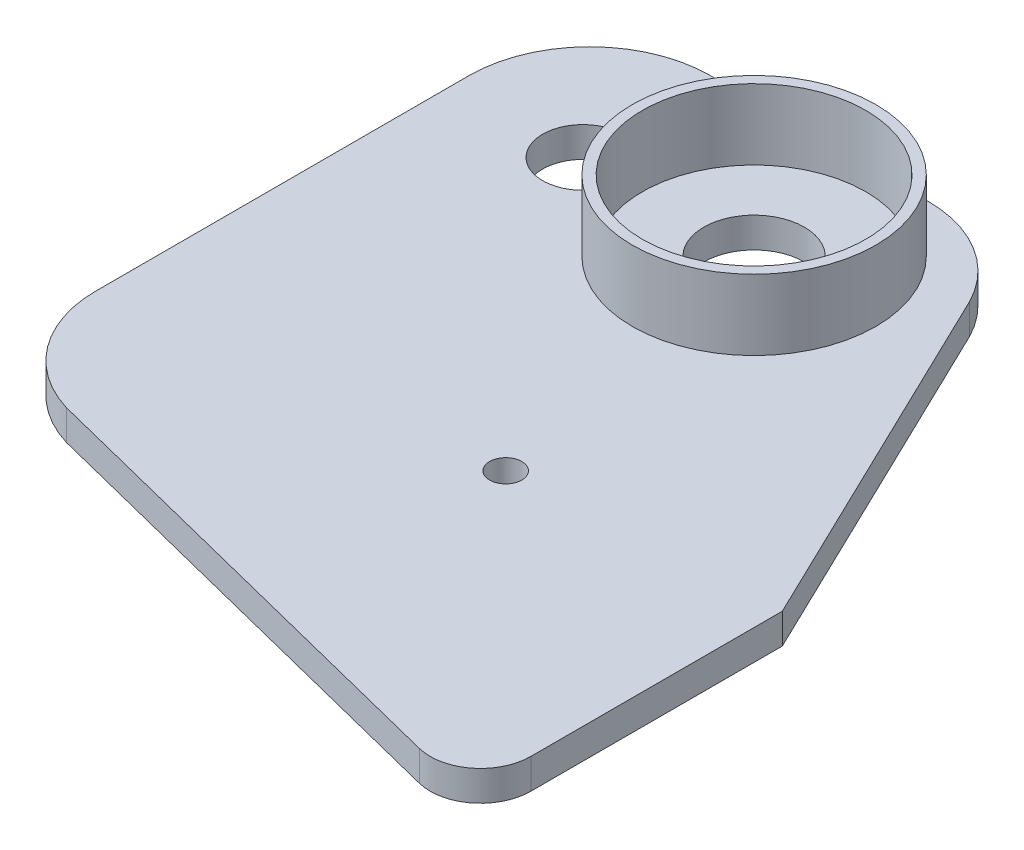
ISO-10303-21;
HEADER;
FILE_DESCRIPTION(('STEP AP214'),'2;1');
FILE_NAME('part.step','',(''),(''),'','','');
FILE_SCHEMA(('AUTOMOTIVE_DESIGN { 1 0 10303 214 1 1 1 1 }'));
ENDSEC;
DATA;
#1=APPLICATION_CONTEXT('core data for automotive mechanical design processes');
#2=APPLICATION_PROTOCOL_DEFINITION('international standard','automotive_design',2000,#1);
#3=PRODUCT_CONTEXT('',#1,'mechanical');
#4=PRODUCT('Part','Part','',(#3));
#5=PRODUCT_RELATED_PRODUCT_CATEGORY('part','',(#4));
#6=PRODUCT_DEFINITION_FORMATION('','',#4);
#7=PRODUCT_DEFINITION_CONTEXT('part definition',#1,'design');
#8=PRODUCT_DEFINITION('design','',#6,#7);
#9=PRODUCT_DEFINITION_SHAPE('','',#8);
#10=(LENGTH_UNIT() NAMED_UNIT(*) SI_UNIT(.MILLI.,.METRE.));
#11=(NAMED_UNIT(*) PLANE_ANGLE_UNIT() SI_UNIT($,.RADIAN.));
#12=(NAMED_UNIT(*) SI_UNIT($,.STERADIAN.) SOLID_ANGLE_UNIT());
#13=UNCERTAINTY_MEASURE_WITH_UNIT(LENGTH_MEASURE(1.E-05),#10,'distance_accuracy_value','');
#14=(GEOMETRIC_REPRESENTATION_CONTEXT(3) GLOBAL_UNCERTAINTY_ASSIGNED_CONTEXT((#13)) GLOBAL_UNIT_ASSIGNED_CONTEXT((#10,
#11,#12)) REPRESENTATION_CONTEXT('',''));
#15=CARTESIAN_POINT('',(0.,0.,0.));
#16=DIRECTION('',(0.,0.,1.));
#17=DIRECTION('',(1.,0.,0.));
#18=AXIS2_PLACEMENT_3D('',#15,#16,#17);
#19=CARTESIAN_POINT('',(40.0428743382507,3.,-32.216581250598));
#20=DIRECTION('',(0.,-1.,0.));
#21=DIRECTION('',(0.,0.,-1.));
#22=AXIS2_PLACEMENT_3D('',#19,#20,#21);
#23=PLANE('',#22);
#24=CARTESIAN_POINT('',(36.135474474537,3.,-30.8460471676936));
#25=DIRECTION('',(0.,1.,0.));
#26=DIRECTION('',(0.,0.,-1.));
#27=AXIS2_PLACEMENT_3D('',#24,#25,#26);
#28=CIRCLE('',#27,5.00000000000001);
#29=CARTESIAN_POINT('',(36.135474474537,3.,-35.8460471676936));
#30=VERTEX_POINT('',#29);
#31=EDGE_CURVE('E446',#30,#30,#28,.T.);
#32=ORIENTED_EDGE('',*,*,#31,.F.);
#33=EDGE_LOOP('',(#32));
#34=FACE_BOUND('',#33,.T.);
#35=CARTESIAN_POINT('',(36.135474474537,3.,-30.8460471676936));
#36=DIRECTION('',(0.,1.,0.));
#37=DIRECTION('',(0.,0.,1.));
#38=AXIS2_PLACEMENT_3D('',#35,#36,#37);
#39=CIRCLE('',#38,11.1);
#40=CARTESIAN_POINT('',(36.135474474537,3.,-19.7460471676936));
#41=VERTEX_POINT('',#40);
#42=EDGE_CURVE('E431',#41,#41,#39,.T.);
#43=ORIENTED_EDGE('',*,*,#42,.T.);
#44=EDGE_LOOP('',(#43));
#45=FACE_BOUND('',#44,.T.);
#46=ADVANCED_FACE('F39',(#34,#45),#23,.F.);
#47=CARTESIAN_POINT('',(22.2388312903351,3.,-40.2163704990975));
#48=DIRECTION('',(0.,1.,0.));
#49=DIRECTION('',(0.,0.,1.));
#50=AXIS2_PLACEMENT_3D('',#47,#48,#49);
#51=CIRCLE('',#50,1.6);
#52=CARTESIAN_POINT('',(22.2388312903351,3.,-38.6163704990975));
#53=VERTEX_POINT('',#52);
#54=EDGE_CURVE('E427',#53,#53,#51,.T.);
#55=ORIENTED_EDGE('',*,*,#54,.F.);
#56=EDGE_LOOP('',(#55));
#57=FACE_BOUND('',#56,.T.);
#58=CARTESIAN_POINT('',(36.135474474537,3.,-30.8460471676936));
#59=DIRECTION('',(0.,-1.,0.));
#60=DIRECTION('',(0.,0.,-1.));
#61=AXIS2_PLACEMENT_3D('',#58,#59,#60);
#62=CIRCLE('',#61,12.1);
#63=CARTESIAN_POINT('',(36.135474474537,3.,-42.9460471676936));
#64=VERTEX_POINT('',#63);
#65=EDGE_CURVE('E11',#64,#64,#62,.F.);
#66=ORIENTED_EDGE('',*,*,#65,.F.);
#67=EDGE_LOOP('',(#66));
#68=FACE_BOUND('',#67,.T.);
#69=CARTESIAN_POINT('',(40.0428743382507,3.,-32.216581250598));
#70=DIRECTION('',(0.,1.,0.));
#71=DIRECTION('',(0.,0.,-1.));
#72=AXIS2_PLACEMENT_3D('',#69,#70,#71);
#73=CIRCLE('',#72,12.000001);
#74=CARTESIAN_POINT('',(50.7602041149026,3.,-37.6146240865241));
#75=VERTEX_POINT('',#74);
#76=CARTESIAN_POINT('',(40.0427326116623,3.,-44.2165822497611));
#77=VERTEX_POINT('',#76);
#78=EDGE_CURVE('E184',#75,#77,#73,.T.);
#79=ORIENTED_EDGE('',*,*,#78,.T.);
#80=DIRECTION('',(-0.999999999929273,0.,1.18934820463317E-05));
#81=VECTOR('',#80,1.);
#82=CARTESIAN_POINT('',(18.4349299690079,3.,-44.2163252577483));
#83=LINE('',#82,#81);
#84=CARTESIAN_POINT('',(18.4349299690079,3.,-44.2163252577483));
#85=VERTEX_POINT('',#84);
#86=EDGE_CURVE('E107',#77,#85,#83,.T.);
#87=ORIENTED_EDGE('',*,*,#86,.T.);
#88=CARTESIAN_POINT('',(18.435072690654,3.,-32.2163368976211));
#89=DIRECTION('',(0.,1.,0.));
#90=DIRECTION('',(0.,0.,-1.));
#91=AXIS2_PLACEMENT_3D('',#88,#89,#90);
#92=CIRCLE('',#91,11.999988360976);
#93=CARTESIAN_POINT('',(6.43508433052965,3.,-32.2161939365866));
#94=VERTEX_POINT('',#93);
#95=EDGE_CURVE('E230',#85,#94,#92,.T.);
#96=ORIENTED_EDGE('',*,*,#95,.T.);
#97=DIRECTION('',(1.18627733153958E-05,0.,0.999999999929637));
#98=VECTOR('',#97,1.);
#99=CARTESIAN_POINT('',(6.43544644453697,3.,-1.69095353369363));
#100=LINE('',#99,#98);
#101=CARTESIAN_POINT('',(6.43544644453697,3.,-1.69095353369363));
#102=VERTEX_POINT('',#101);
#103=EDGE_CURVE('E226',#94,#102,#100,.T.);
#104=ORIENTED_EDGE('',*,*,#103,.T.);
#105=DIRECTION('',(1.19134310966162E-05,0.,0.999999999929035));
#106=VECTOR('',#105,1.);
#107=CARTESIAN_POINT('',(6.43544644453697,3.,-1.69095353369363));
#108=LINE('',#107,#106);
#109=CARTESIAN_POINT('',(6.43552431461504,3.,4.84537319138531));
#110=VERTEX_POINT('',#109);
#111=EDGE_CURVE('E228',#102,#110,#108,.T.);
#112=ORIENTED_EDGE('',*,*,#111,.T.);
#113=CARTESIAN_POINT('',(18.4355243137682,3.,4.84523062653266));
#114=DIRECTION('',(0.,1.,0.));
#115=DIRECTION('',(0.,0.,-1.));
#116=AXIS2_PLACEMENT_3D('',#113,#114,#115);
#117=CIRCLE('',#116,12.0000000000001);
#118=CARTESIAN_POINT('',(14.9998908917222,3.,16.3429009553132));
#119=VERTEX_POINT('',#118);
#120=EDGE_CURVE('E234',#110,#119,#117,.T.);
#121=ORIENTED_EDGE('',*,*,#120,.T.);
#122=DIRECTION('',(0.969769579192456,0.,0.244022464688983));
#123=VECTOR('',#122,1.);
#124=CARTESIAN_POINT('',(61.8646856411741,3.,28.1354576278246));
#125=LINE('',#124,#123);
#126=CARTESIAN_POINT('',(61.8646856411741,3.,28.1354576278246));
#127=VERTEX_POINT('',#126);
#128=EDGE_CURVE('E133',#119,#127,#125,.T.);
#129=ORIENTED_EDGE('',*,*,#128,.T.);
#130=CARTESIAN_POINT('',(63.0847987377872,3.,23.2866099264142));
#131=DIRECTION('',(0.,1.,0.));
#132=DIRECTION('',(0.,0.,-1.));
#133=AXIS2_PLACEMENT_3D('',#130,#131,#132);
#134=CIRCLE('',#133,5.);
#135=CARTESIAN_POINT('',(68.0847987368031,3.,23.2865107215391));
#136=VERTEX_POINT('',#135);
#137=EDGE_CURVE('E126',#127,#136,#134,.T.);
#138=ORIENTED_EDGE('',*,*,#137,.T.);
#139=DIRECTION('',(-1.99566968971164E-05,0.,-0.999999999800865));
#140=VECTOR('',#139,1.);
#141=CARTESIAN_POINT('',(68.0843000099019,3.,-1.7039425395256));
#142=LINE('',#141,#140);
#143=CARTESIAN_POINT('',(68.0843000099019,3.,-1.7039425395256));
#144=VERTEX_POINT('',#143);
#145=EDGE_CURVE('E131',#136,#144,#142,.T.);
#146=ORIENTED_EDGE('',*,*,#145,.T.);
#147=DIRECTION('',(-0.434503028481843,0.,-0.900670371578918));
#148=VECTOR('',#147,1.);
#149=CARTESIAN_POINT('',(50.7602041149026,3.,-37.6146240865241));
#150=LINE('',#149,#148);
#151=EDGE_CURVE('E57',#144,#75,#150,.T.);
#152=ORIENTED_EDGE('',*,*,#151,.T.);
#153=EDGE_LOOP('',(#79,#87,#96,#104,#112,#121,#129,#138,#146,#152));
#154=FACE_BOUND('',#153,.T.);
#155=CARTESIAN_POINT('',(42.260458862537,3.,-0.0416202926936254));
#156=DIRECTION('',(0.,1.,0.));
#157=DIRECTION('',(0.,0.,-1.));
#158=AXIS2_PLACEMENT_3D('',#155,#156,#157);
#159=CIRCLE('',#158,1.59999999999999);
#160=CARTESIAN_POINT('',(42.260458862537,3.,-1.64162029269362));
#161=VERTEX_POINT('',#160);
#162=EDGE_CURVE('E160',#161,#161,#159,.T.);
#163=ORIENTED_EDGE('',*,*,#162,.F.);
#164=EDGE_LOOP('',(#163));
#165=FACE_BOUND('',#164,.T.);
#166=CARTESIAN_POINT('',(19.135475969537,3.,-30.8419455666936));
#167=DIRECTION('',(0.,1.,0.));
#168=DIRECTION('',(0.,0.,-1.));
#169=AXIS2_PLACEMENT_3D('',#166,#167,#168);
#170=CIRCLE('',#169,4.00000000000001);
#171=CARTESIAN_POINT('',(19.135475969537,3.,-34.8419455666936));
#172=VERTEX_POINT('',#171);
#173=EDGE_CURVE('E454',#172,#172,#170,.T.);
#174=ORIENTED_EDGE('',*,*,#173,.F.);
#175=EDGE_LOOP('',(#174));
#176=FACE_BOUND('',#175,.T.);
#177=ADVANCED_FACE('F128',(#57,#68,#154,#165,#176),#23,.F.);
#178=CARTESIAN_POINT('',(40.0428743382507,0.,-32.216581250598));
#179=DIRECTION('',(0.,-1.,0.));
#180=DIRECTION('',(0.,0.,-1.));
#181=AXIS2_PLACEMENT_3D('',#178,#179,#180);
#182=PLANE('',#181);
#183=CARTESIAN_POINT('',(22.2388312903351,0.,-40.2163704990975));
#184=DIRECTION('',(0.,1.,0.));
#185=DIRECTION('',(0.,0.,1.));
#186=AXIS2_PLACEMENT_3D('',#183,#184,#185);
#187=CIRCLE('',#186,1.6);
#188=CARTESIAN_POINT('',(22.2388312903351,0.,-38.6163704990975));
#189=VERTEX_POINT('',#188);
#190=EDGE_CURVE('E424',#189,#189,#187,.T.);
#191=ORIENTED_EDGE('',*,*,#190,.T.);
#192=EDGE_LOOP('',(#191));
#193=FACE_BOUND('',#192,.T.);
#194=CARTESIAN_POINT('',(19.135475969537,0.,-30.8419455666936));
#195=DIRECTION('',(0.,1.,0.));
#196=DIRECTION('',(0.,0.,-1.));
#197=AXIS2_PLACEMENT_3D('',#194,#195,#196);
#198=CIRCLE('',#197,4.00000000000001);
#199=CARTESIAN_POINT('',(19.135475969537,0.,-34.8419455666936));
#200=VERTEX_POINT('',#199);
#201=EDGE_CURVE('E450',#200,#200,#198,.T.);
#202=ORIENTED_EDGE('',*,*,#201,.T.);
#203=EDGE_LOOP('',(#202));
#204=FACE_BOUND('',#203,.T.);
#205=CARTESIAN_POINT('',(40.0428743382507,0.,-32.216581250598));
#206=DIRECTION('',(0.,1.,0.));
#207=DIRECTION('',(0.,0.,-1.));
#208=AXIS2_PLACEMENT_3D('',#205,#206,#207);
#209=CIRCLE('',#208,12.000001);
#210=CARTESIAN_POINT('',(50.7602041149026,0.,-37.6146240865241));
#211=VERTEX_POINT('',#210);
#212=CARTESIAN_POINT('',(40.0427326116623,0.,-44.2165822497611));
#213=VERTEX_POINT('',#212);
#214=EDGE_CURVE('E155',#211,#213,#209,.T.);
#215=ORIENTED_EDGE('',*,*,#214,.F.);
#216=DIRECTION('',(-0.434503028481843,0.,-0.900670371578918));
#217=VECTOR('',#216,1.);
#218=CARTESIAN_POINT('',(50.7602041149026,0.,-37.6146240865241));
#219=LINE('',#218,#217);
#220=CARTESIAN_POINT('',(68.0843000099019,0.,-1.7039425395256));
#221=VERTEX_POINT('',#220);
#222=EDGE_CURVE('E98',#221,#211,#219,.T.);
#223=ORIENTED_EDGE('',*,*,#222,.F.);
#224=DIRECTION('',(-1.99566968971164E-05,0.,-0.999999999800865));
#225=VECTOR('',#224,1.);
#226=CARTESIAN_POINT('',(68.0843000099019,0.,-1.7039425395256));
#227=LINE('',#226,#225);
#228=CARTESIAN_POINT('',(68.0847987368031,0.,23.2865107215391));
#229=VERTEX_POINT('',#228);
#230=EDGE_CURVE('E92',#229,#221,#227,.T.);
#231=ORIENTED_EDGE('',*,*,#230,.F.);
#232=CARTESIAN_POINT('',(63.0847987377872,0.,23.2866099264142));
#233=DIRECTION('',(0.,1.,0.));
#234=DIRECTION('',(0.,0.,-1.));
#235=AXIS2_PLACEMENT_3D('',#232,#233,#234);
#236=CIRCLE('',#235,5.);
#237=CARTESIAN_POINT('',(61.8646856411741,0.,28.1354576278246));
#238=VERTEX_POINT('',#237);
#239=EDGE_CURVE('E142',#238,#229,#236,.T.);
#240=ORIENTED_EDGE('',*,*,#239,.F.);
#241=DIRECTION('',(0.969769579192456,0.,0.244022464688983));
#242=VECTOR('',#241,1.);
#243=CARTESIAN_POINT('',(61.8646856411741,0.,28.1354576278246));
#244=LINE('',#243,#242);
#245=CARTESIAN_POINT('',(14.9998908917222,0.,16.3429009553132));
#246=VERTEX_POINT('',#245);
#247=EDGE_CURVE('E175',#246,#238,#244,.T.);
#248=ORIENTED_EDGE('',*,*,#247,.F.);
#249=CARTESIAN_POINT('',(18.4355243137682,0.,4.84523062653266));
#250=DIRECTION('',(0.,1.,0.));
#251=DIRECTION('',(0.,0.,-1.));
#252=AXIS2_PLACEMENT_3D('',#249,#250,#251);
#253=CIRCLE('',#252,12.0000000000001);
#254=CARTESIAN_POINT('',(6.43552431461504,0.,4.84537319138531));
#255=VERTEX_POINT('',#254);
#256=EDGE_CURVE('E172',#255,#246,#253,.T.);
#257=ORIENTED_EDGE('',*,*,#256,.F.);
#258=DIRECTION('',(1.19134310966162E-05,0.,0.999999999929035));
#259=VECTOR('',#258,1.);
#260=CARTESIAN_POINT('',(6.43544644453697,0.,-1.69095353369363));
#261=LINE('',#260,#259);
#262=CARTESIAN_POINT('',(6.43544644453697,0.,-1.69095353369363));
#263=VERTEX_POINT('',#262);
#264=EDGE_CURVE('E169',#263,#255,#261,.T.);
#265=ORIENTED_EDGE('',*,*,#264,.F.);
#266=DIRECTION('',(1.18627733153958E-05,0.,0.999999999929637));
#267=VECTOR('',#266,1.);
#268=CARTESIAN_POINT('',(6.43544644453697,0.,-1.69095353369363));
#269=LINE('',#268,#267);
#270=CARTESIAN_POINT('',(6.43508433052965,0.,-32.2161939365866));
#271=VERTEX_POINT('',#270);
#272=EDGE_CURVE('E166',#271,#263,#269,.T.);
#273=ORIENTED_EDGE('',*,*,#272,.F.);
#274=CARTESIAN_POINT('',(18.435072690654,0.,-32.2163368976211));
#275=DIRECTION('',(0.,1.,0.));
#276=DIRECTION('',(0.,0.,-1.));
#277=AXIS2_PLACEMENT_3D('',#274,#275,#276);
#278=CIRCLE('',#277,11.999988360976);
#279=CARTESIAN_POINT('',(18.4349299690079,0.,-44.2163252577483));
#280=VERTEX_POINT('',#279);
#281=EDGE_CURVE('E163',#280,#271,#278,.T.);
#282=ORIENTED_EDGE('',*,*,#281,.F.);
#283=DIRECTION('',(-0.999999999929273,0.,1.18934820463317E-05));
#284=VECTOR('',#283,1.);
#285=CARTESIAN_POINT('',(18.4349299690079,0.,-44.2163252577483));
#286=LINE('',#285,#284);
#287=EDGE_CURVE('E159',#213,#280,#286,.T.);
#288=ORIENTED_EDGE('',*,*,#287,.F.);
#289=EDGE_LOOP('',(#215,#223,#231,#240,#248,#257,#265,#273,#282,#288));
#290=FACE_BOUND('',#289,.T.);
#291=CARTESIAN_POINT('',(42.260458862537,0.,-0.0416202926936254));
#292=DIRECTION('',(0.,1.,0.));
#293=DIRECTION('',(0.,0.,-1.));
#294=AXIS2_PLACEMENT_3D('',#291,#292,#293);
#295=CIRCLE('',#294,1.59999999999999);
#296=CARTESIAN_POINT('',(42.260458862537,0.,-1.64162029269362));
#297=VERTEX_POINT('',#296);
#298=EDGE_CURVE('E458',#297,#297,#295,.T.);
#299=ORIENTED_EDGE('',*,*,#298,.T.);
#300=EDGE_LOOP('',(#299));
#301=FACE_BOUND('',#300,.T.);
#302=CARTESIAN_POINT('',(36.135474474537,0.,-30.8460471676936));
#303=DIRECTION('',(0.,1.,0.));
#304=DIRECTION('',(0.,0.,-1.));
#305=AXIS2_PLACEMENT_3D('',#302,#303,#304);
#306=CIRCLE('',#305,5.00000000000001);
#307=CARTESIAN_POINT('',(36.135474474537,0.,-35.8460471676936));
#308=VERTEX_POINT('',#307);
#309=EDGE_CURVE('E445',#308,#308,#306,.T.);
#310=ORIENTED_EDGE('',*,*,#309,.T.);
#311=EDGE_LOOP('',(#310));
#312=FACE_BOUND('',#311,.T.);
#313=ADVANCED_FACE('F213',(#193,#204,#290,#301,#312),#182,.T.);
#314=CARTESIAN_POINT('',(40.0428743382507,3.,-32.216581250598));
#315=DIRECTION('',(0.,-1.,0.));
#316=DIRECTION('',(0.,0.,-1.));
#317=AXIS2_PLACEMENT_3D('',#314,#315,#316);
#318=CYLINDRICAL_SURFACE('',#317,12.000001);
#319=ORIENTED_EDGE('',*,*,#214,.T.);
#320=DIRECTION('',(0.,-1.,0.));
#321=VECTOR('',#320,1.);
#322=CARTESIAN_POINT('',(40.0427326116623,3.,-44.2165822497611));
#323=LINE('',#322,#321);
#324=EDGE_CURVE('E49',#77,#213,#323,.T.);
#325=ORIENTED_EDGE('',*,*,#324,.F.);
#326=ORIENTED_EDGE('',*,*,#78,.F.);
#327=DIRECTION('',(0.,-1.,0.));
#328=VECTOR('',#327,1.);
#329=CARTESIAN_POINT('',(50.7602041149026,3.,-37.6146240865241));
#330=LINE('',#329,#328);
#331=EDGE_CURVE('E151',#75,#211,#330,.T.);
#332=ORIENTED_EDGE('',*,*,#331,.T.);
#333=EDGE_LOOP('',(#319,#325,#326,#332));
#334=FACE_BOUND('',#333,.T.);
#335=ADVANCED_FACE('F41',(#334),#318,.T.);
#336=CARTESIAN_POINT('',(18.4349299690079,3.,-44.2163252577483));
#337=DIRECTION('',(1.18934820463317E-05,0.,0.999999999929273));
#338=DIRECTION('',(0.999999999929273,0.,-1.18934820463317E-05));
#339=AXIS2_PLACEMENT_3D('',#336,#337,#338);
#340=PLANE('',#339);
#341=ORIENTED_EDGE('',*,*,#287,.T.);
#342=DIRECTION('',(0.,-1.,0.));
#343=VECTOR('',#342,1.);
#344=CARTESIAN_POINT('',(18.4349299690079,3.,-44.2163252577483));
#345=LINE('',#344,#343);
#346=EDGE_CURVE('E203',#85,#280,#345,.T.);
#347=ORIENTED_EDGE('',*,*,#346,.F.);
#348=ORIENTED_EDGE('',*,*,#86,.F.);
#349=ORIENTED_EDGE('',*,*,#324,.T.);
#350=EDGE_LOOP('',(#341,#347,#348,#349));
#351=FACE_BOUND('',#350,.T.);
#352=ADVANCED_FACE('F208',(#351),#340,.F.);
#353=CARTESIAN_POINT('',(18.435072690654,3.,-32.2163368976211));
#354=DIRECTION('',(0.,-1.,0.));
#355=DIRECTION('',(0.,0.,-1.));
#356=AXIS2_PLACEMENT_3D('',#353,#354,#355);
#357=CYLINDRICAL_SURFACE('',#356,11.999988360976);
#358=ORIENTED_EDGE('',*,*,#281,.T.);
#359=DIRECTION('',(0.,-1.,0.));
#360=VECTOR('',#359,1.);
#361=CARTESIAN_POINT('',(6.43508433052965,3.,-32.2161939365866));
#362=LINE('',#361,#360);
#363=EDGE_CURVE('E199',#94,#271,#362,.T.);
#364=ORIENTED_EDGE('',*,*,#363,.F.);
#365=ORIENTED_EDGE('',*,*,#95,.F.);
#366=ORIENTED_EDGE('',*,*,#346,.T.);
#367=EDGE_LOOP('',(#358,#364,#365,#366));
#368=FACE_BOUND('',#367,.T.);
#369=ADVANCED_FACE('F220',(#368),#357,.T.);
#370=CARTESIAN_POINT('',(6.43544644453697,3.,-1.69095353369363));
#371=DIRECTION('',(0.999999999929035,0.,-1.19134310966162E-05));
#372=DIRECTION('',(-1.19134310966162E-05,0.,-0.999999999929035));
#373=AXIS2_PLACEMENT_3D('',#370,#371,#372);
#374=PLANE('',#373);
#375=ORIENTED_EDGE('',*,*,#264,.T.);
#376=DIRECTION('',(0.,-1.,0.));
#377=VECTOR('',#376,1.);
#378=CARTESIAN_POINT('',(6.43552431461504,3.,4.84537319138531));
#379=LINE('',#378,#377);
#380=EDGE_CURVE('E195',#110,#255,#379,.T.);
#381=ORIENTED_EDGE('',*,*,#380,.F.);
#382=ORIENTED_EDGE('',*,*,#111,.F.);
#383=ORIENTED_EDGE('',*,*,#103,.F.);
#384=ORIENTED_EDGE('',*,*,#363,.T.);
#385=ORIENTED_EDGE('',*,*,#272,.T.);
#386=EDGE_LOOP('',(#375,#381,#382,#383,#384,#385));
#387=FACE_BOUND('',#386,.T.);
#388=ADVANCED_FACE('F224',(#387),#374,.F.);
#389=CARTESIAN_POINT('',(18.4355243137682,3.,4.84523062653266));
#390=DIRECTION('',(0.,-1.,0.));
#391=DIRECTION('',(0.,0.,-1.));
#392=AXIS2_PLACEMENT_3D('',#389,#390,#391);
#393=CYLINDRICAL_SURFACE('',#392,12.0000000000001);
#394=ORIENTED_EDGE('',*,*,#256,.T.);
#395=DIRECTION('',(0.,-1.,0.));
#396=VECTOR('',#395,1.);
#397=CARTESIAN_POINT('',(14.9998908917222,3.,16.3429009553132));
#398=LINE('',#397,#396);
#399=EDGE_CURVE('E191',#119,#246,#398,.T.);
#400=ORIENTED_EDGE('',*,*,#399,.F.);
#401=ORIENTED_EDGE('',*,*,#120,.F.);
#402=ORIENTED_EDGE('',*,*,#380,.T.);
#403=EDGE_LOOP('',(#394,#400,#401,#402));
#404=FACE_BOUND('',#403,.T.);
#405=ADVANCED_FACE('F244',(#404),#393,.T.);
#406=CARTESIAN_POINT('',(61.8646856411741,3.,28.1354576278246));
#407=DIRECTION('',(0.244022464688983,0.,-0.969769579192457));
#408=DIRECTION('',(-0.969769579192457,0.,-0.244022464688983));
#409=AXIS2_PLACEMENT_3D('',#406,#407,#408);
#410=PLANE('',#409);
#411=ORIENTED_EDGE('',*,*,#247,.T.);
#412=DIRECTION('',(0.,-1.,0.));
#413=VECTOR('',#412,1.);
#414=CARTESIAN_POINT('',(61.8646856411741,3.,28.1354576278246));
#415=LINE('',#414,#413);
#416=EDGE_CURVE('E144',#127,#238,#415,.T.);
#417=ORIENTED_EDGE('',*,*,#416,.F.);
#418=ORIENTED_EDGE('',*,*,#128,.F.);
#419=ORIENTED_EDGE('',*,*,#399,.T.);
#420=EDGE_LOOP('',(#411,#417,#418,#419));
#421=FACE_BOUND('',#420,.T.);
#422=ADVANCED_FACE('F248',(#421),#410,.F.);
#423=CARTESIAN_POINT('',(63.0847987377872,3.,23.2866099264142));
#424=DIRECTION('',(0.,-1.,0.));
#425=DIRECTION('',(0.,0.,-1.));
#426=AXIS2_PLACEMENT_3D('',#423,#424,#425);
#427=CYLINDRICAL_SURFACE('',#426,5.);
#428=ORIENTED_EDGE('',*,*,#239,.T.);
#429=DIRECTION('',(0.,-1.,0.));
#430=VECTOR('',#429,1.);
#431=CARTESIAN_POINT('',(68.0847987368031,3.,23.2865107215391));
#432=LINE('',#431,#430);
#433=EDGE_CURVE('E139',#136,#229,#432,.T.);
#434=ORIENTED_EDGE('',*,*,#433,.F.);
#435=ORIENTED_EDGE('',*,*,#137,.F.);
#436=ORIENTED_EDGE('',*,*,#416,.T.);
#437=EDGE_LOOP('',(#428,#434,#435,#436));
#438=FACE_BOUND('',#437,.T.);
#439=ADVANCED_FACE('F140',(#438),#427,.T.);
#440=CARTESIAN_POINT('',(68.0843000099019,3.,-1.7039425395256));
#441=DIRECTION('',(-0.999999999800865,0.,1.99566968971164E-05));
#442=DIRECTION('',(1.99566968971164E-05,0.,0.999999999800865));
#443=AXIS2_PLACEMENT_3D('',#440,#441,#442);
#444=PLANE('',#443);
#445=ORIENTED_EDGE('',*,*,#230,.T.);
#446=DIRECTION('',(0.,-1.,0.));
#447=VECTOR('',#446,1.);
#448=CARTESIAN_POINT('',(68.0843000099019,3.,-1.7039425395256));
#449=LINE('',#448,#447);
#450=EDGE_CURVE('E145',#144,#221,#449,.T.);
#451=ORIENTED_EDGE('',*,*,#450,.F.);
#452=ORIENTED_EDGE('',*,*,#145,.F.);
#453=ORIENTED_EDGE('',*,*,#433,.T.);
#454=EDGE_LOOP('',(#445,#451,#452,#453));
#455=FACE_BOUND('',#454,.T.);
#456=ADVANCED_FACE('F147',(#455),#444,.F.);
#457=CARTESIAN_POINT('',(50.7602041149026,3.,-37.6146240865241));
#458=DIRECTION('',(-0.900670371578918,0.,0.434503028481843));
#459=DIRECTION('',(0.434503028481843,0.,0.900670371578918));
#460=AXIS2_PLACEMENT_3D('',#457,#458,#459);
#461=PLANE('',#460);
#462=ORIENTED_EDGE('',*,*,#222,.T.);
#463=ORIENTED_EDGE('',*,*,#331,.F.);
#464=ORIENTED_EDGE('',*,*,#151,.F.);
#465=ORIENTED_EDGE('',*,*,#450,.T.);
#466=EDGE_LOOP('',(#462,#463,#464,#465));
#467=FACE_BOUND('',#466,.T.);
#468=ADVANCED_FACE('F273',(#467),#461,.F.);
#469=CARTESIAN_POINT('',(42.260458862537,3.,-0.0416202926936254));
#470=DIRECTION('',(0.,-1.,0.));
#471=DIRECTION('',(0.,0.,-1.));
#472=AXIS2_PLACEMENT_3D('',#469,#470,#471);
#473=CYLINDRICAL_SURFACE('',#472,1.59999999999999);
#474=ORIENTED_EDGE('',*,*,#162,.T.);
#475=EDGE_LOOP('',(#474));
#476=FACE_BOUND('',#475,.T.);
#477=ORIENTED_EDGE('',*,*,#298,.F.);
#478=EDGE_LOOP('',(#477));
#479=FACE_BOUND('',#478,.T.);
#480=ADVANCED_FACE('F268',(#476,#479),#473,.F.);
#481=CARTESIAN_POINT('',(19.135475969537,3.,-30.8419455666936));
#482=DIRECTION('',(0.,-1.,0.));
#483=DIRECTION('',(0.,0.,-1.));
#484=AXIS2_PLACEMENT_3D('',#481,#482,#483);
#485=CYLINDRICAL_SURFACE('',#484,4.00000000000001);
#486=ORIENTED_EDGE('',*,*,#173,.T.);
#487=EDGE_LOOP('',(#486));
#488=FACE_BOUND('',#487,.T.);
#489=ORIENTED_EDGE('',*,*,#201,.F.);
#490=EDGE_LOOP('',(#489));
#491=FACE_BOUND('',#490,.T.);
#492=ADVANCED_FACE('F291',(#488,#491),#485,.F.);
#493=CARTESIAN_POINT('',(36.135474474537,3.,-30.8460471676936));
#494=DIRECTION('',(0.,-1.,0.));
#495=DIRECTION('',(0.,0.,-1.));
#496=AXIS2_PLACEMENT_3D('',#493,#494,#495);
#497=CYLINDRICAL_SURFACE('',#496,5.00000000000001);
#498=ORIENTED_EDGE('',*,*,#31,.T.);
#499=EDGE_LOOP('',(#498));
#500=FACE_BOUND('',#499,.T.);
#501=ORIENTED_EDGE('',*,*,#309,.F.);
#502=EDGE_LOOP('',(#501));
#503=FACE_BOUND('',#502,.T.);
#504=ADVANCED_FACE('F298',(#500,#503),#497,.F.);
#505=CARTESIAN_POINT('',(36.135474474537,10.,-30.8460471676936));
#506=DIRECTION('',(0.,1.,0.));
#507=DIRECTION('',(0.,0.,1.));
#508=AXIS2_PLACEMENT_3D('',#505,#506,#507);
#509=PLANE('',#508);
#510=CARTESIAN_POINT('',(36.135474474537,10.,-30.8460471676936));
#511=DIRECTION('',(0.,1.,0.));
#512=DIRECTION('',(0.,0.,1.));
#513=AXIS2_PLACEMENT_3D('',#510,#511,#512);
#514=CIRCLE('',#513,12.1);
#515=CARTESIAN_POINT('',(36.135474474537,10.,-18.7460471676936));
#516=VERTEX_POINT('',#515);
#517=EDGE_CURVE('E438',#516,#516,#514,.T.);
#518=ORIENTED_EDGE('',*,*,#517,.T.);
#519=EDGE_LOOP('',(#518));
#520=FACE_BOUND('',#519,.T.);
#521=CARTESIAN_POINT('',(36.135474474537,10.,-30.8460471676936));
#522=DIRECTION('',(0.,1.,0.));
#523=DIRECTION('',(0.,0.,1.));
#524=AXIS2_PLACEMENT_3D('',#521,#522,#523);
#525=CIRCLE('',#524,11.1);
#526=CARTESIAN_POINT('',(36.135474474537,10.,-19.7460471676936));
#527=VERTEX_POINT('',#526);
#528=EDGE_CURVE('E434',#527,#527,#525,.T.);
#529=ORIENTED_EDGE('',*,*,#528,.F.);
#530=EDGE_LOOP('',(#529));
#531=FACE_BOUND('',#530,.T.);
#532=ADVANCED_FACE('F305',(#520,#531),#509,.T.);
#533=CARTESIAN_POINT('',(36.135474474537,10.,-30.8460471676936));
#534=DIRECTION('',(0.,-1.,0.));
#535=DIRECTION('',(0.,0.,-1.));
#536=AXIS2_PLACEMENT_3D('',#533,#534,#535);
#537=CYLINDRICAL_SURFACE('',#536,12.1);
#538=ORIENTED_EDGE('',*,*,#517,.F.);
#539=EDGE_LOOP('',(#538));
#540=FACE_BOUND('',#539,.T.);
#541=ORIENTED_EDGE('',*,*,#65,.T.);
#542=EDGE_LOOP('',(#541));
#543=FACE_BOUND('',#542,.T.);
#544=ADVANCED_FACE('F313',(#540,#543),#537,.T.);
#545=CARTESIAN_POINT('',(36.135474474537,10.,-30.8460471676936));
#546=DIRECTION('',(0.,-1.,0.));
#547=DIRECTION('',(0.,0.,-1.));
#548=AXIS2_PLACEMENT_3D('',#545,#546,#547);
#549=CYLINDRICAL_SURFACE('',#548,11.1);
#550=ORIENTED_EDGE('',*,*,#528,.T.);
#551=EDGE_LOOP('',(#550));
#552=FACE_BOUND('',#551,.T.);
#553=ORIENTED_EDGE('',*,*,#42,.F.);
#554=EDGE_LOOP('',(#553));
#555=FACE_BOUND('',#554,.T.);
#556=ADVANCED_FACE('F321',(#552,#555),#549,.F.);
#557=CARTESIAN_POINT('',(22.2388312903351,0.,-40.2163704990975));
#558=DIRECTION('',(0.,1.,0.));
#559=DIRECTION('',(0.,0.,1.));
#560=AXIS2_PLACEMENT_3D('',#557,#558,#559);
#561=CYLINDRICAL_SURFACE('',#560,1.6);
#562=ORIENTED_EDGE('',*,*,#190,.F.);
#563=EDGE_LOOP('',(#562));
#564=FACE_BOUND('',#563,.T.);
#565=ORIENTED_EDGE('',*,*,#54,.T.);
#566=EDGE_LOOP('',(#565));
#567=FACE_BOUND('',#566,.T.);
#568=ADVANCED_FACE('F329',(#564,#567),#561,.F.);
#569=CLOSED_SHELL('',(#46,#177,#313,#335,#352,#369,#388,#405,#422,#439,#456,#468,#480,#492,#504,
#532,#544,#556,#568));
#570=MANIFOLD_SOLID_BREP('B2',#569);
#571=ADVANCED_BREP_SHAPE_REPRESENTATION('',(#18,#570),#14);
#572=SHAPE_DEFINITION_REPRESENTATION(#9,#571);
ENDSEC;
END-ISO-10303-21;
